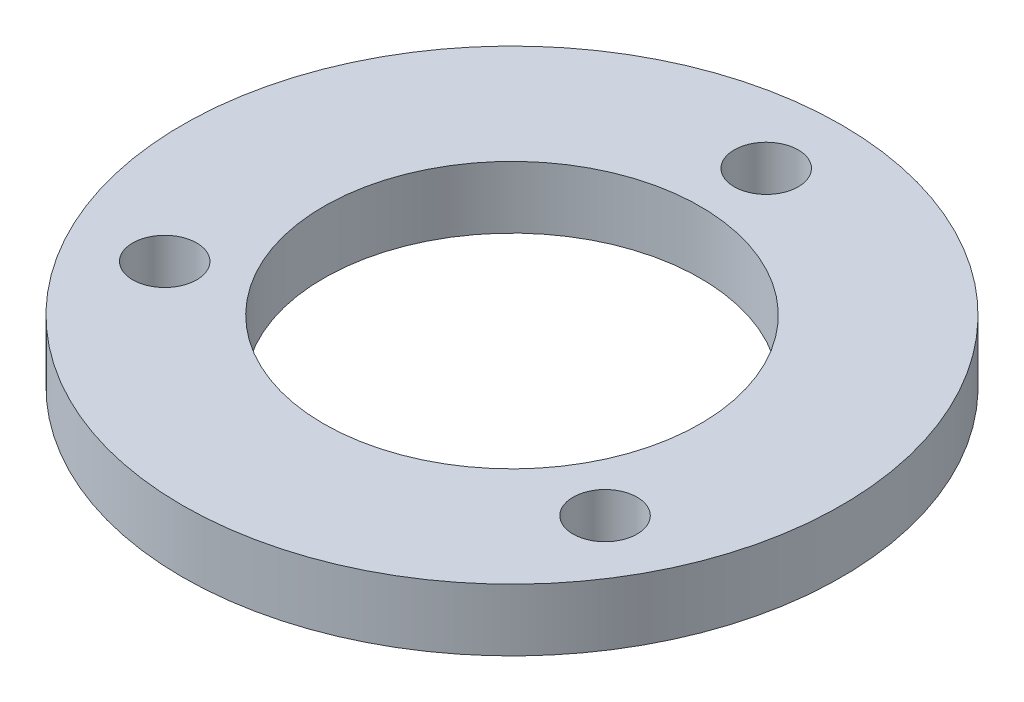
ISO-10303-21;
HEADER;
FILE_DESCRIPTION(('STEP AP214'),'2;1');
FILE_NAME('part.step','',(''),(''),'','','');
FILE_SCHEMA(('AUTOMOTIVE_DESIGN { 1 0 10303 214 1 1 1 1 }'));
ENDSEC;
DATA;
#1=APPLICATION_CONTEXT('core data for automotive mechanical design processes');
#2=APPLICATION_PROTOCOL_DEFINITION('international standard','automotive_design',2000,#1);
#3=PRODUCT_CONTEXT('',#1,'mechanical');
#4=PRODUCT('Part','Part','',(#3));
#5=PRODUCT_RELATED_PRODUCT_CATEGORY('part','',(#4));
#6=PRODUCT_DEFINITION_FORMATION('','',#4);
#7=PRODUCT_DEFINITION_CONTEXT('part definition',#1,'design');
#8=PRODUCT_DEFINITION('design','',#6,#7);
#9=PRODUCT_DEFINITION_SHAPE('','',#8);
#10=(LENGTH_UNIT() NAMED_UNIT(*) SI_UNIT(.MILLI.,.METRE.));
#11=(NAMED_UNIT(*) PLANE_ANGLE_UNIT() SI_UNIT($,.RADIAN.));
#12=(NAMED_UNIT(*) SI_UNIT($,.STERADIAN.) SOLID_ANGLE_UNIT());
#13=UNCERTAINTY_MEASURE_WITH_UNIT(LENGTH_MEASURE(1.E-05),#10,'distance_accuracy_value','');
#14=(GEOMETRIC_REPRESENTATION_CONTEXT(3) GLOBAL_UNCERTAINTY_ASSIGNED_CONTEXT((#13)) GLOBAL_UNIT_ASSIGNED_CONTEXT((#10,
#11,#12)) REPRESENTATION_CONTEXT('',''));
#15=CARTESIAN_POINT('',(0.,0.,0.));
#16=DIRECTION('',(0.,0.,1.));
#17=DIRECTION('',(1.,0.,0.));
#18=AXIS2_PLACEMENT_3D('',#15,#16,#17);
#19=CARTESIAN_POINT('',(0.,3.3,0.));
#20=DIRECTION('',(0.,1.,0.));
#21=DIRECTION('',(0.,0.,1.));
#22=AXIS2_PLACEMENT_3D('',#19,#20,#21);
#23=PLANE('',#22);
#24=CARTESIAN_POINT('',(11.6913429510899,3.3,6.75));
#25=DIRECTION('',(0.,1.,0.));
#26=DIRECTION('',(0.,0.,1.));
#27=AXIS2_PLACEMENT_3D('',#24,#25,#26);
#28=CIRCLE('',#27,1.7);
#29=CARTESIAN_POINT('',(11.6913429510899,3.3,8.45));
#30=VERTEX_POINT('',#29);
#31=EDGE_CURVE('E67',#30,#30,#28,.T.);
#32=ORIENTED_EDGE('',*,*,#31,.F.);
#33=EDGE_LOOP('',(#32));
#34=FACE_BOUND('',#33,.T.);
#35=CARTESIAN_POINT('',(0.,3.3,0.));
#36=DIRECTION('',(0.,1.,0.));
#37=DIRECTION('',(0.,0.,1.));
#38=AXIS2_PLACEMENT_3D('',#35,#36,#37);
#39=CIRCLE('',#38,10.);
#40=CARTESIAN_POINT('',(0.,3.3,10.));
#41=VERTEX_POINT('',#40);
#42=EDGE_CURVE('E53',#41,#41,#39,.T.);
#43=ORIENTED_EDGE('',*,*,#42,.F.);
#44=EDGE_LOOP('',(#43));
#45=FACE_BOUND('',#44,.T.);
#46=CARTESIAN_POINT('',(0.,3.3,0.));
#47=DIRECTION('',(0.,1.,0.));
#48=DIRECTION('',(0.,0.,1.));
#49=AXIS2_PLACEMENT_3D('',#46,#47,#48);
#50=CIRCLE('',#49,17.5);
#51=CARTESIAN_POINT('',(0.,3.3,17.5));
#52=VERTEX_POINT('',#51);
#53=EDGE_CURVE('E10',#52,#52,#50,.T.);
#54=ORIENTED_EDGE('',*,*,#53,.T.);
#55=EDGE_LOOP('',(#54));
#56=FACE_BOUND('',#55,.T.);
#57=CARTESIAN_POINT('',(0.,3.3,-13.5));
#58=DIRECTION('',(0.,1.,0.));
#59=DIRECTION('',(0.,0.,1.));
#60=AXIS2_PLACEMENT_3D('',#57,#58,#59);
#61=CIRCLE('',#60,1.7);
#62=CARTESIAN_POINT('',(0.,3.3,-11.8));
#63=VERTEX_POINT('',#62);
#64=EDGE_CURVE('E59',#63,#63,#61,.T.);
#65=ORIENTED_EDGE('',*,*,#64,.F.);
#66=EDGE_LOOP('',(#65));
#67=FACE_BOUND('',#66,.T.);
#68=CARTESIAN_POINT('',(-11.6913429510899,3.3,6.75000000000001));
#69=DIRECTION('',(0.,1.,0.));
#70=DIRECTION('',(0.,0.,1.));
#71=AXIS2_PLACEMENT_3D('',#68,#69,#70);
#72=CIRCLE('',#71,1.7);
#73=CARTESIAN_POINT('',(-11.6913429510899,3.3,8.45000000000001));
#74=VERTEX_POINT('',#73);
#75=EDGE_CURVE('E74',#74,#74,#72,.T.);
#76=ORIENTED_EDGE('',*,*,#75,.F.);
#77=EDGE_LOOP('',(#76));
#78=FACE_BOUND('',#77,.T.);
#79=ADVANCED_FACE('F38',(#34,#45,#56,#67,#78),#23,.T.);
#80=CARTESIAN_POINT('',(0.,0.,0.));
#81=DIRECTION('',(0.,1.,0.));
#82=DIRECTION('',(0.,0.,1.));
#83=AXIS2_PLACEMENT_3D('',#80,#81,#82);
#84=PLANE('',#83);
#85=CARTESIAN_POINT('',(0.,0.,0.));
#86=DIRECTION('',(0.,1.,0.));
#87=DIRECTION('',(0.,0.,1.));
#88=AXIS2_PLACEMENT_3D('',#85,#86,#87);
#89=CIRCLE('',#88,17.5);
#90=CARTESIAN_POINT('',(0.,0.,17.5));
#91=VERTEX_POINT('',#90);
#92=EDGE_CURVE('E42',#91,#91,#89,.T.);
#93=ORIENTED_EDGE('',*,*,#92,.F.);
#94=EDGE_LOOP('',(#93));
#95=FACE_BOUND('',#94,.T.);
#96=CARTESIAN_POINT('',(0.,0.,0.));
#97=DIRECTION('',(0.,1.,0.));
#98=DIRECTION('',(0.,0.,1.));
#99=AXIS2_PLACEMENT_3D('',#96,#97,#98);
#100=CIRCLE('',#99,10.);
#101=CARTESIAN_POINT('',(0.,0.,10.));
#102=VERTEX_POINT('',#101);
#103=EDGE_CURVE('E55',#102,#102,#100,.T.);
#104=ORIENTED_EDGE('',*,*,#103,.T.);
#105=EDGE_LOOP('',(#104));
#106=FACE_BOUND('',#105,.T.);
#107=CARTESIAN_POINT('',(0.,0.,-13.5));
#108=DIRECTION('',(0.,1.,0.));
#109=DIRECTION('',(0.,0.,1.));
#110=AXIS2_PLACEMENT_3D('',#107,#108,#109);
#111=CIRCLE('',#110,1.7);
#112=CARTESIAN_POINT('',(0.,0.,-11.8));
#113=VERTEX_POINT('',#112);
#114=EDGE_CURVE('E63',#113,#113,#111,.T.);
#115=ORIENTED_EDGE('',*,*,#114,.T.);
#116=EDGE_LOOP('',(#115));
#117=FACE_BOUND('',#116,.T.);
#118=CARTESIAN_POINT('',(11.6913429510899,0.,6.75));
#119=DIRECTION('',(0.,1.,0.));
#120=DIRECTION('',(0.,0.,1.));
#121=AXIS2_PLACEMENT_3D('',#118,#119,#120);
#122=CIRCLE('',#121,1.7);
#123=CARTESIAN_POINT('',(11.6913429510899,0.,8.45));
#124=VERTEX_POINT('',#123);
#125=EDGE_CURVE('E71',#124,#124,#122,.T.);
#126=ORIENTED_EDGE('',*,*,#125,.T.);
#127=EDGE_LOOP('',(#126));
#128=FACE_BOUND('',#127,.T.);
#129=CARTESIAN_POINT('',(-11.6913429510899,0.,6.75000000000001));
#130=DIRECTION('',(0.,1.,0.));
#131=DIRECTION('',(0.,0.,1.));
#132=AXIS2_PLACEMENT_3D('',#129,#130,#131);
#133=CIRCLE('',#132,1.7);
#134=CARTESIAN_POINT('',(-11.6913429510899,0.,8.45000000000001));
#135=VERTEX_POINT('',#134);
#136=EDGE_CURVE('E77',#135,#135,#133,.T.);
#137=ORIENTED_EDGE('',*,*,#136,.T.);
#138=EDGE_LOOP('',(#137));
#139=FACE_BOUND('',#138,.T.);
#140=ADVANCED_FACE('F89',(#95,#106,#117,#128,#139),#84,.F.);
#141=CARTESIAN_POINT('',(0.,3.3,0.));
#142=DIRECTION('',(0.,-1.,0.));
#143=DIRECTION('',(0.,0.,-1.));
#144=AXIS2_PLACEMENT_3D('',#141,#142,#143);
#145=CYLINDRICAL_SURFACE('',#144,17.5);
#146=ORIENTED_EDGE('',*,*,#53,.F.);
#147=EDGE_LOOP('',(#146));
#148=FACE_BOUND('',#147,.T.);
#149=ORIENTED_EDGE('',*,*,#92,.T.);
#150=EDGE_LOOP('',(#149));
#151=FACE_BOUND('',#150,.T.);
#152=ADVANCED_FACE('F40',(#148,#151),#145,.T.);
#153=CARTESIAN_POINT('',(0.,3.3,0.));
#154=DIRECTION('',(0.,-1.,0.));
#155=DIRECTION('',(0.,0.,-1.));
#156=AXIS2_PLACEMENT_3D('',#153,#154,#155);
#157=CYLINDRICAL_SURFACE('',#156,10.);
#158=ORIENTED_EDGE('',*,*,#42,.T.);
#159=EDGE_LOOP('',(#158));
#160=FACE_BOUND('',#159,.T.);
#161=ORIENTED_EDGE('',*,*,#103,.F.);
#162=EDGE_LOOP('',(#161));
#163=FACE_BOUND('',#162,.T.);
#164=ADVANCED_FACE('F99',(#160,#163),#157,.F.);
#165=CARTESIAN_POINT('',(0.,3.3,-13.5));
#166=DIRECTION('',(0.,-1.,0.));
#167=DIRECTION('',(0.,0.,-1.));
#168=AXIS2_PLACEMENT_3D('',#165,#166,#167);
#169=CYLINDRICAL_SURFACE('',#168,1.7);
#170=ORIENTED_EDGE('',*,*,#64,.T.);
#171=EDGE_LOOP('',(#170));
#172=FACE_BOUND('',#171,.T.);
#173=ORIENTED_EDGE('',*,*,#114,.F.);
#174=EDGE_LOOP('',(#173));
#175=FACE_BOUND('',#174,.T.);
#176=ADVANCED_FACE('F102',(#172,#175),#169,.F.);
#177=CARTESIAN_POINT('',(11.6913429510899,3.3,6.75));
#178=DIRECTION('',(0.,-1.,0.));
#179=DIRECTION('',(0.,0.,-1.));
#180=AXIS2_PLACEMENT_3D('',#177,#178,#179);
#181=CYLINDRICAL_SURFACE('',#180,1.7);
#182=ORIENTED_EDGE('',*,*,#31,.T.);
#183=EDGE_LOOP('',(#182));
#184=FACE_BOUND('',#183,.T.);
#185=ORIENTED_EDGE('',*,*,#125,.F.);
#186=EDGE_LOOP('',(#185));
#187=FACE_BOUND('',#186,.T.);
#188=ADVANCED_FACE('F106',(#184,#187),#181,.F.);
#189=CARTESIAN_POINT('',(-11.6913429510899,3.3,6.75000000000001));
#190=DIRECTION('',(0.,-1.,0.));
#191=DIRECTION('',(0.,0.,-1.));
#192=AXIS2_PLACEMENT_3D('',#189,#190,#191);
#193=CYLINDRICAL_SURFACE('',#192,1.7);
#194=ORIENTED_EDGE('',*,*,#75,.T.);
#195=EDGE_LOOP('',(#194));
#196=FACE_BOUND('',#195,.T.);
#197=ORIENTED_EDGE('',*,*,#136,.F.);
#198=EDGE_LOOP('',(#197));
#199=FACE_BOUND('',#198,.T.);
#200=ADVANCED_FACE('F85',(#196,#199),#193,.F.);
#201=CLOSED_SHELL('',(#79,#140,#152,#164,#176,#188,#200));
#202=MANIFOLD_SOLID_BREP('B2',#201);
#203=ADVANCED_BREP_SHAPE_REPRESENTATION('',(#18,#202),#14);
#204=SHAPE_DEFINITION_REPRESENTATION(#9,#203);
ENDSEC;
END-ISO-10303-21;
